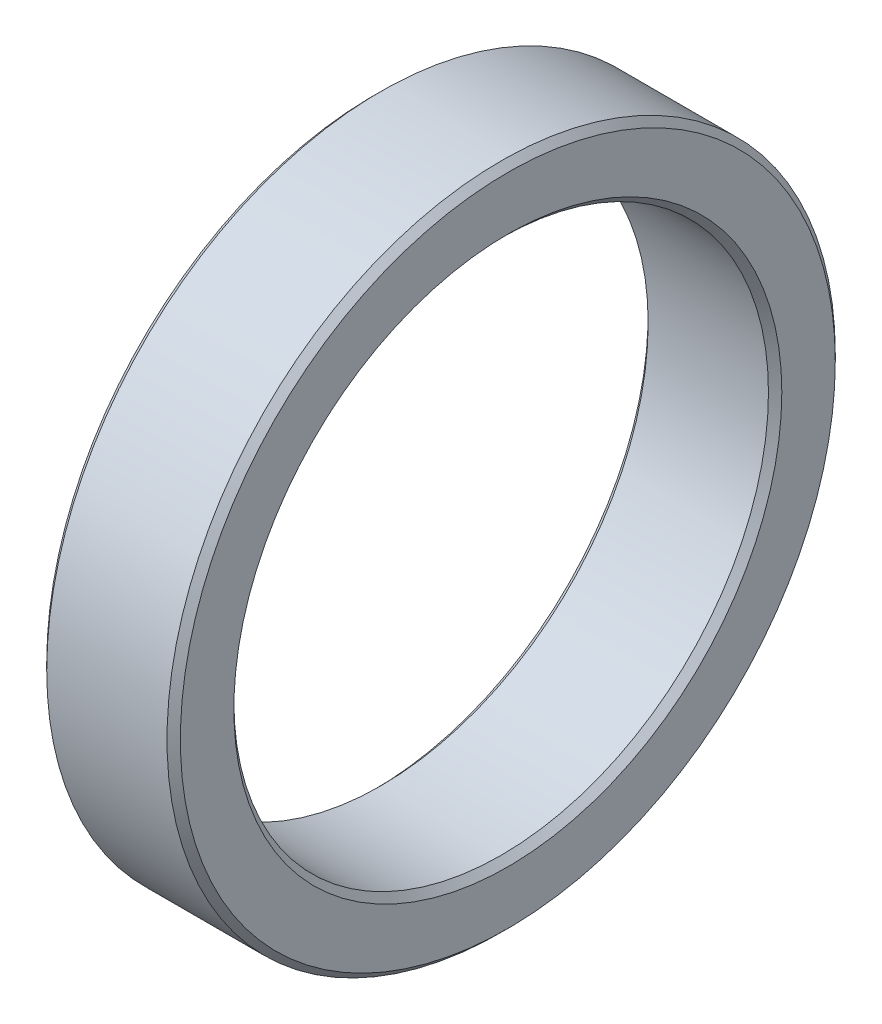
ISO-10303-21;
HEADER;
FILE_DESCRIPTION(('STEP AP214'),'2;1');
FILE_NAME('part.step','',(''),(''),'','','');
FILE_SCHEMA(('AUTOMOTIVE_DESIGN { 1 0 10303 214 1 1 1 1 }'));
ENDSEC;
DATA;
#1=APPLICATION_CONTEXT('core data for automotive mechanical design processes');
#2=APPLICATION_PROTOCOL_DEFINITION('international standard','automotive_design',2000,#1);
#3=PRODUCT_CONTEXT('',#1,'mechanical');
#4=PRODUCT('Part','Part','',(#3));
#5=PRODUCT_RELATED_PRODUCT_CATEGORY('part','',(#4));
#6=PRODUCT_DEFINITION_FORMATION('','',#4);
#7=PRODUCT_DEFINITION_CONTEXT('part definition',#1,'design');
#8=PRODUCT_DEFINITION('design','',#6,#7);
#9=PRODUCT_DEFINITION_SHAPE('','',#8);
#10=(LENGTH_UNIT() NAMED_UNIT(*) SI_UNIT(.MILLI.,.METRE.));
#11=(NAMED_UNIT(*) PLANE_ANGLE_UNIT() SI_UNIT($,.RADIAN.));
#12=(NAMED_UNIT(*) SI_UNIT($,.STERADIAN.) SOLID_ANGLE_UNIT());
#13=UNCERTAINTY_MEASURE_WITH_UNIT(LENGTH_MEASURE(1.E-05),#10,'distance_accuracy_value','');
#14=(GEOMETRIC_REPRESENTATION_CONTEXT(3) GLOBAL_UNCERTAINTY_ASSIGNED_CONTEXT((#13)) GLOBAL_UNIT_ASSIGNED_CONTEXT((#10,
#11,#12)) REPRESENTATION_CONTEXT('',''));
#15=CARTESIAN_POINT('',(0.,0.,0.));
#16=DIRECTION('',(0.,0.,1.));
#17=DIRECTION('',(1.,0.,0.));
#18=AXIS2_PLACEMENT_3D('',#15,#16,#17);
#19=CARTESIAN_POINT('',(2.22044604925032E-13,25.0000000000004,4.44089209850063E-13));
#20=DIRECTION('',(1.,0.,0.));
#21=DIRECTION('',(0.,0.,-1.));
#22=AXIS2_PLACEMENT_3D('',#19,#20,#21);
#23=PLANE('',#22);
#24=CARTESIAN_POINT('',(0.,0.,0.));
#25=DIRECTION('',(1.,0.,0.));
#26=DIRECTION('',(0.,0.,-1.));
#27=AXIS2_PLACEMENT_3D('',#24,#25,#26);
#28=CIRCLE('',#27,20.5);
#29=CARTESIAN_POINT('',(0.,0.,-20.5));
#30=VERTEX_POINT('',#29);
#31=EDGE_CURVE('E34',#30,#30,#28,.F.);
#32=ORIENTED_EDGE('',*,*,#31,.T.);
#33=EDGE_LOOP('',(#32));
#34=FACE_BOUND('',#33,.T.);
#35=CARTESIAN_POINT('',(0.,0.,0.));
#36=DIRECTION('',(1.,0.,0.));
#37=DIRECTION('',(0.,0.,-1.));
#38=AXIS2_PLACEMENT_3D('',#35,#36,#37);
#39=CIRCLE('',#38,24.5);
#40=CARTESIAN_POINT('',(0.,0.,-24.5));
#41=VERTEX_POINT('',#40);
#42=EDGE_CURVE('E37',#41,#41,#39,.T.);
#43=ORIENTED_EDGE('',*,*,#42,.T.);
#44=EDGE_LOOP('',(#43));
#45=FACE_BOUND('',#44,.T.);
#46=ADVANCED_FACE('F14',(#34,#45),#23,.T.);
#47=CARTESIAN_POINT('',(0.,0.,0.));
#48=DIRECTION('',(1.,0.,0.));
#49=DIRECTION('',(0.,0.,-1.));
#50=AXIS2_PLACEMENT_3D('',#47,#48,#49);
#51=CYLINDRICAL_SURFACE('',#50,20.);
#52=CARTESIAN_POINT('',(-0.499999999999945,0.,0.));
#53=DIRECTION('',(1.,0.,0.));
#54=DIRECTION('',(0.,0.,-1.));
#55=AXIS2_PLACEMENT_3D('',#52,#53,#54);
#56=CIRCLE('',#55,20.);
#57=CARTESIAN_POINT('',(-0.499999999999945,0.,-20.));
#58=VERTEX_POINT('',#57);
#59=EDGE_CURVE('E40',#58,#58,#56,.T.);
#60=ORIENTED_EDGE('',*,*,#59,.T.);
#61=EDGE_LOOP('',(#60));
#62=FACE_BOUND('',#61,.T.);
#63=CARTESIAN_POINT('',(-9.49999999999984,0.,-4.44089209850063E-13));
#64=DIRECTION('',(-1.,0.,0.));
#65=DIRECTION('',(0.,0.,1.));
#66=AXIS2_PLACEMENT_3D('',#63,#64,#65);
#67=CIRCLE('',#66,20.);
#68=CARTESIAN_POINT('',(-9.49999999999984,0.,19.9999999999996));
#69=VERTEX_POINT('',#68);
#70=EDGE_CURVE('E43',#69,#69,#67,.T.);
#71=ORIENTED_EDGE('',*,*,#70,.T.);
#72=EDGE_LOOP('',(#71));
#73=FACE_BOUND('',#72,.T.);
#74=ADVANCED_FACE('F47',(#62,#73),#51,.F.);
#75=CARTESIAN_POINT('',(-9.99999999999979,20.0000000000005,0.));
#76=DIRECTION('',(-1.,0.,0.));
#77=DIRECTION('',(0.,0.,1.));
#78=AXIS2_PLACEMENT_3D('',#75,#76,#77);
#79=PLANE('',#78);
#80=CARTESIAN_POINT('',(-10.,0.,0.));
#81=DIRECTION('',(-1.,0.,0.));
#82=DIRECTION('',(0.,0.,1.));
#83=AXIS2_PLACEMENT_3D('',#80,#81,#82);
#84=CIRCLE('',#83,24.5);
#85=CARTESIAN_POINT('',(-10.,0.,24.5));
#86=VERTEX_POINT('',#85);
#87=EDGE_CURVE('E10',#86,#86,#84,.T.);
#88=ORIENTED_EDGE('',*,*,#87,.T.);
#89=EDGE_LOOP('',(#88));
#90=FACE_BOUND('',#89,.T.);
#91=CARTESIAN_POINT('',(-10.,0.,0.));
#92=DIRECTION('',(-1.,0.,0.));
#93=DIRECTION('',(0.,0.,1.));
#94=AXIS2_PLACEMENT_3D('',#91,#92,#93);
#95=CIRCLE('',#94,20.5);
#96=CARTESIAN_POINT('',(-10.,0.,20.5));
#97=VERTEX_POINT('',#96);
#98=EDGE_CURVE('E21',#97,#97,#95,.F.);
#99=ORIENTED_EDGE('',*,*,#98,.T.);
#100=EDGE_LOOP('',(#99));
#101=FACE_BOUND('',#100,.T.);
#102=ADVANCED_FACE('F66',(#90,#101),#79,.T.);
#103=CARTESIAN_POINT('',(0.,0.,0.));
#104=DIRECTION('',(1.,0.,0.));
#105=DIRECTION('',(0.,0.,-1.));
#106=AXIS2_PLACEMENT_3D('',#103,#104,#105);
#107=CYLINDRICAL_SURFACE('',#106,25.);
#108=CARTESIAN_POINT('',(-0.499999999999945,0.,0.));
#109=DIRECTION('',(1.,0.,0.));
#110=DIRECTION('',(0.,0.,-1.));
#111=AXIS2_PLACEMENT_3D('',#108,#109,#110);
#112=CIRCLE('',#111,25.);
#113=CARTESIAN_POINT('',(-0.499999999999945,0.,-25.));
#114=VERTEX_POINT('',#113);
#115=EDGE_CURVE('E25',#114,#114,#112,.F.);
#116=ORIENTED_EDGE('',*,*,#115,.T.);
#117=EDGE_LOOP('',(#116));
#118=FACE_BOUND('',#117,.T.);
#119=CARTESIAN_POINT('',(-9.49999999999984,0.,-4.44089209850063E-13));
#120=DIRECTION('',(-1.,0.,0.));
#121=DIRECTION('',(0.,0.,1.));
#122=AXIS2_PLACEMENT_3D('',#119,#120,#121);
#123=CIRCLE('',#122,25.);
#124=CARTESIAN_POINT('',(-9.49999999999984,0.,24.9999999999996));
#125=VERTEX_POINT('',#124);
#126=EDGE_CURVE('E29',#125,#125,#123,.F.);
#127=ORIENTED_EDGE('',*,*,#126,.T.);
#128=EDGE_LOOP('',(#127));
#129=FACE_BOUND('',#128,.T.);
#130=ADVANCED_FACE('F75',(#118,#129),#107,.T.);
#131=CARTESIAN_POINT('',(-0.499999999999945,0.,0.));
#132=DIRECTION('',(1.,0.,0.));
#133=DIRECTION('',(0.,0.,-1.));
#134=AXIS2_PLACEMENT_3D('',#131,#132,#133);
#135=CONICAL_SURFACE('',#134,20.,0.785398163397455);
#136=ORIENTED_EDGE('',*,*,#31,.F.);
#137=EDGE_LOOP('',(#136));
#138=FACE_BOUND('',#137,.T.);
#139=ORIENTED_EDGE('',*,*,#59,.F.);
#140=EDGE_LOOP('',(#139));
#141=FACE_BOUND('',#140,.T.);
#142=ADVANCED_FACE('F72',(#138,#141),#135,.F.);
#143=CARTESIAN_POINT('',(0.,0.,0.));
#144=DIRECTION('',(-1.,0.,0.));
#145=DIRECTION('',(0.,0.,1.));
#146=AXIS2_PLACEMENT_3D('',#143,#144,#145);
#147=CONICAL_SURFACE('',#146,24.5,0.785398163397438);
#148=ORIENTED_EDGE('',*,*,#115,.F.);
#149=EDGE_LOOP('',(#148));
#150=FACE_BOUND('',#149,.T.);
#151=ORIENTED_EDGE('',*,*,#42,.F.);
#152=EDGE_LOOP('',(#151));
#153=FACE_BOUND('',#152,.T.);
#154=ADVANCED_FACE('F57',(#150,#153),#147,.T.);
#155=CARTESIAN_POINT('',(-9.49999999999984,0.,-4.44089209850063E-13));
#156=DIRECTION('',(1.,0.,0.));
#157=DIRECTION('',(0.,0.,-1.));
#158=AXIS2_PLACEMENT_3D('',#155,#156,#157);
#159=CONICAL_SURFACE('',#158,25.,0.785398163397452);
#160=ORIENTED_EDGE('',*,*,#87,.F.);
#161=EDGE_LOOP('',(#160));
#162=FACE_BOUND('',#161,.T.);
#163=ORIENTED_EDGE('',*,*,#126,.F.);
#164=EDGE_LOOP('',(#163));
#165=FACE_BOUND('',#164,.T.);
#166=ADVANCED_FACE('F51',(#162,#165),#159,.T.);
#167=CARTESIAN_POINT('',(-10.,0.,0.));
#168=DIRECTION('',(-1.,0.,0.));
#169=DIRECTION('',(0.,0.,1.));
#170=AXIS2_PLACEMENT_3D('',#167,#168,#169);
#171=CONICAL_SURFACE('',#170,20.5,0.785398163397445);
#172=ORIENTED_EDGE('',*,*,#70,.F.);
#173=EDGE_LOOP('',(#172));
#174=FACE_BOUND('',#173,.T.);
#175=ORIENTED_EDGE('',*,*,#98,.F.);
#176=EDGE_LOOP('',(#175));
#177=FACE_BOUND('',#176,.T.);
#178=ADVANCED_FACE('F16',(#174,#177),#171,.F.);
#179=CLOSED_SHELL('',(#46,#74,#102,#130,#142,#154,#166,#178));
#180=MANIFOLD_SOLID_BREP('B1',#179);
#181=ADVANCED_BREP_SHAPE_REPRESENTATION('',(#18,#180),#14);
#182=SHAPE_DEFINITION_REPRESENTATION(#9,#181);
ENDSEC;
END-ISO-10303-21;
